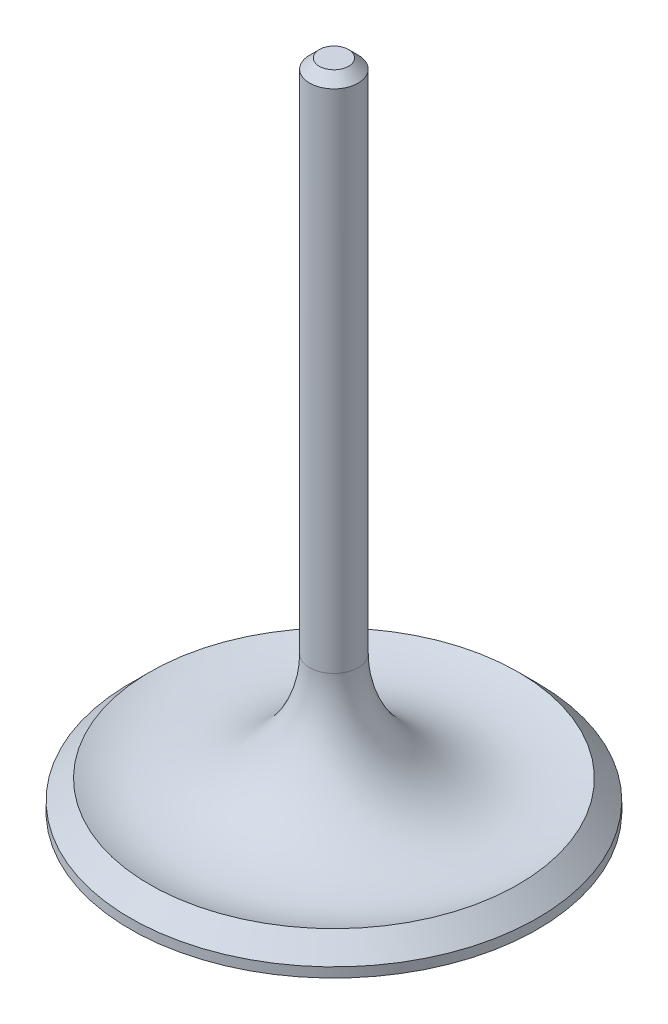
ISO-10303-21;
HEADER;
FILE_DESCRIPTION(('STEP AP214'),'2;1');
FILE_NAME('part.step','',(''),(''),'','','');
FILE_SCHEMA(('AUTOMOTIVE_DESIGN { 1 0 10303 214 1 1 1 1 }'));
ENDSEC;
DATA;
#1=APPLICATION_CONTEXT('core data for automotive mechanical design processes');
#2=APPLICATION_PROTOCOL_DEFINITION('international standard','automotive_design',2000,#1);
#3=PRODUCT_CONTEXT('',#1,'mechanical');
#4=PRODUCT('Part','Part','',(#3));
#5=PRODUCT_RELATED_PRODUCT_CATEGORY('part','',(#4));
#6=PRODUCT_DEFINITION_FORMATION('','',#4);
#7=PRODUCT_DEFINITION_CONTEXT('part definition',#1,'design');
#8=PRODUCT_DEFINITION('design','',#6,#7);
#9=PRODUCT_DEFINITION_SHAPE('','',#8);
#10=(LENGTH_UNIT() NAMED_UNIT(*) SI_UNIT(.MILLI.,.METRE.));
#11=(NAMED_UNIT(*) PLANE_ANGLE_UNIT() SI_UNIT($,.RADIAN.));
#12=(NAMED_UNIT(*) SI_UNIT($,.STERADIAN.) SOLID_ANGLE_UNIT());
#13=UNCERTAINTY_MEASURE_WITH_UNIT(LENGTH_MEASURE(1.E-05),#10,'distance_accuracy_value','');
#14=(GEOMETRIC_REPRESENTATION_CONTEXT(3) GLOBAL_UNCERTAINTY_ASSIGNED_CONTEXT((#13)) GLOBAL_UNIT_ASSIGNED_CONTEXT((#10,
#11,#12)) REPRESENTATION_CONTEXT('',''));
#15=CARTESIAN_POINT('',(0.,0.,0.));
#16=DIRECTION('',(0.,0.,1.));
#17=DIRECTION('',(1.,0.,0.));
#18=AXIS2_PLACEMENT_3D('',#15,#16,#17);
#19=CARTESIAN_POINT('',(0.,301.007097060259,0.));
#20=DIRECTION('',(0.,-1.,0.));
#21=DIRECTION('',(0.,0.,-1.));
#22=AXIS2_PLACEMENT_3D('',#19,#20,#21);
#23=PLANE('',#22);
#24=CARTESIAN_POINT('',(0.,301.007097060259,0.));
#25=DIRECTION('',(0.,-1.,0.));
#26=DIRECTION('',(0.,0.,-1.));
#27=AXIS2_PLACEMENT_3D('',#24,#25,#26);
#28=CIRCLE('',#27,26.67);
#29=CARTESIAN_POINT('',(0.,301.007097060259,-26.67));
#30=VERTEX_POINT('',#29);
#31=EDGE_CURVE('E49',#30,#30,#28,.T.);
#32=ORIENTED_EDGE('',*,*,#31,.T.);
#33=EDGE_LOOP('',(#32));
#34=FACE_BOUND('',#33,.T.);
#35=ADVANCED_FACE('F38',(#34),#23,.T.);
#36=CARTESIAN_POINT('',(0.,301.007097060259,0.));
#37=DIRECTION('',(0.,-1.,0.));
#38=DIRECTION('',(0.,0.,-1.));
#39=AXIS2_PLACEMENT_3D('',#36,#37,#38);
#40=CYLINDRICAL_SURFACE('',#39,26.67);
#41=CARTESIAN_POINT('',(0.,302.277097060259,0.));
#42=DIRECTION('',(0.,-1.,0.));
#43=DIRECTION('',(0.,0.,-1.));
#44=AXIS2_PLACEMENT_3D('',#41,#42,#43);
#45=CIRCLE('',#44,26.67);
#46=CARTESIAN_POINT('',(0.,302.277097060259,-26.67));
#47=VERTEX_POINT('',#46);
#48=EDGE_CURVE('E53',#47,#47,#45,.T.);
#49=ORIENTED_EDGE('',*,*,#48,.T.);
#50=EDGE_LOOP('',(#49));
#51=FACE_BOUND('',#50,.T.);
#52=ORIENTED_EDGE('',*,*,#31,.F.);
#53=EDGE_LOOP('',(#52));
#54=FACE_BOUND('',#53,.T.);
#55=ADVANCED_FACE('F80',(#51,#54),#40,.T.);
#56=CARTESIAN_POINT('',(0.,302.277097060259,0.));
#57=DIRECTION('',(0.,-1.,0.));
#58=DIRECTION('',(0.,0.,-1.));
#59=AXIS2_PLACEMENT_3D('',#56,#57,#58);
#60=CONICAL_SURFACE('',#59,26.67,0.785398163397444);
#61=CARTESIAN_POINT('',(0.,304.817097060259,0.));
#62=DIRECTION('',(0.,-1.,0.));
#63=DIRECTION('',(0.,0.,-1.));
#64=AXIS2_PLACEMENT_3D('',#61,#62,#63);
#65=CIRCLE('',#64,24.13);
#66=CARTESIAN_POINT('',(0.,304.817097060259,-24.13));
#67=VERTEX_POINT('',#66);
#68=EDGE_CURVE('E58',#67,#67,#65,.T.);
#69=ORIENTED_EDGE('',*,*,#68,.T.);
#70=EDGE_LOOP('',(#69));
#71=FACE_BOUND('',#70,.T.);
#72=ORIENTED_EDGE('',*,*,#48,.F.);
#73=EDGE_LOOP('',(#72));
#74=FACE_BOUND('',#73,.T.);
#75=ADVANCED_FACE('F77',(#71,#74),#60,.T.);
#76=CARTESIAN_POINT('',(0.,318.961795713819,0.));
#77=DIRECTION('',(0.,-1.,0.));
#78=DIRECTION('',(0.,0.,-1.));
#79=AXIS2_PLACEMENT_3D('',#76,#77,#78);
#80=TOROIDAL_SURFACE('',#79,18.43,15.25);
#81=CARTESIAN_POINT('',(0.,318.961795713819,0.));
#82=DIRECTION('',(0.,-1.,0.));
#83=DIRECTION('',(0.,0.,-1.));
#84=AXIS2_PLACEMENT_3D('',#81,#82,#83);
#85=CIRCLE('',#84,3.18000000000001);
#86=CARTESIAN_POINT('',(0.,318.961795713819,-3.18000000000003));
#87=VERTEX_POINT('',#86);
#88=EDGE_CURVE('E61',#87,#87,#85,.T.);
#89=ORIENTED_EDGE('',*,*,#88,.T.);
#90=EDGE_LOOP('',(#89));
#91=FACE_BOUND('',#90,.T.);
#92=ORIENTED_EDGE('',*,*,#68,.F.);
#93=EDGE_LOOP('',(#92));
#94=FACE_BOUND('',#93,.T.);
#95=ADVANCED_FACE('F65',(#91,#94),#80,.F.);
#96=CARTESIAN_POINT('',(0.,301.007097060259,0.));
#97=DIRECTION('',(0.,-1.,0.));
#98=DIRECTION('',(0.,0.,-1.));
#99=AXIS2_PLACEMENT_3D('',#96,#97,#98);
#100=CYLINDRICAL_SURFACE('',#99,3.18000000000001);
#101=CARTESIAN_POINT('',(0.,385.287097060259,0.));
#102=DIRECTION('',(0.,1.,0.));
#103=DIRECTION('',(0.,0.,1.));
#104=AXIS2_PLACEMENT_3D('',#101,#102,#103);
#105=CIRCLE('',#104,3.18000000000001);
#106=CARTESIAN_POINT('',(0.,385.287097060259,3.17999999999998));
#107=VERTEX_POINT('',#106);
#108=EDGE_CURVE('E45',#107,#107,#105,.F.);
#109=ORIENTED_EDGE('',*,*,#108,.T.);
#110=EDGE_LOOP('',(#109));
#111=FACE_BOUND('',#110,.T.);
#112=ORIENTED_EDGE('',*,*,#88,.F.);
#113=EDGE_LOOP('',(#112));
#114=FACE_BOUND('',#113,.T.);
#115=ADVANCED_FACE('F68',(#111,#114),#100,.T.);
#116=CARTESIAN_POINT('',(0.,386.557097060259,0.));
#117=DIRECTION('',(0.,1.,0.));
#118=DIRECTION('',(0.,0.,1.));
#119=AXIS2_PLACEMENT_3D('',#116,#117,#118);
#120=PLANE('',#119);
#121=CARTESIAN_POINT('',(0.,386.557097060259,0.));
#122=DIRECTION('',(0.,1.,0.));
#123=DIRECTION('',(0.,0.,1.));
#124=AXIS2_PLACEMENT_3D('',#121,#122,#123);
#125=CIRCLE('',#124,1.91000000000002);
#126=CARTESIAN_POINT('',(0.,386.557097060259,1.90999999999999));
#127=VERTEX_POINT('',#126);
#128=EDGE_CURVE('E10',#127,#127,#125,.T.);
#129=ORIENTED_EDGE('',*,*,#128,.T.);
#130=EDGE_LOOP('',(#129));
#131=FACE_BOUND('',#130,.T.);
#132=ADVANCED_FACE('F70',(#131),#120,.T.);
#133=CARTESIAN_POINT('',(0.,385.287097060259,0.));
#134=DIRECTION('',(0.,-1.,0.));
#135=DIRECTION('',(0.,0.,-1.));
#136=AXIS2_PLACEMENT_3D('',#133,#134,#135);
#137=CONICAL_SURFACE('',#136,3.18000000000001,0.785398163397442);
#138=ORIENTED_EDGE('',*,*,#128,.F.);
#139=EDGE_LOOP('',(#138));
#140=FACE_BOUND('',#139,.T.);
#141=ORIENTED_EDGE('',*,*,#108,.F.);
#142=EDGE_LOOP('',(#141));
#143=FACE_BOUND('',#142,.T.);
#144=ADVANCED_FACE('F40',(#140,#143),#137,.T.);
#145=CLOSED_SHELL('',(#35,#55,#75,#95,#115,#132,#144));
#146=MANIFOLD_SOLID_BREP('B2',#145);
#147=ADVANCED_BREP_SHAPE_REPRESENTATION('',(#18,#146),#14);
#148=SHAPE_DEFINITION_REPRESENTATION(#9,#147);
ENDSEC;
END-ISO-10303-21;
